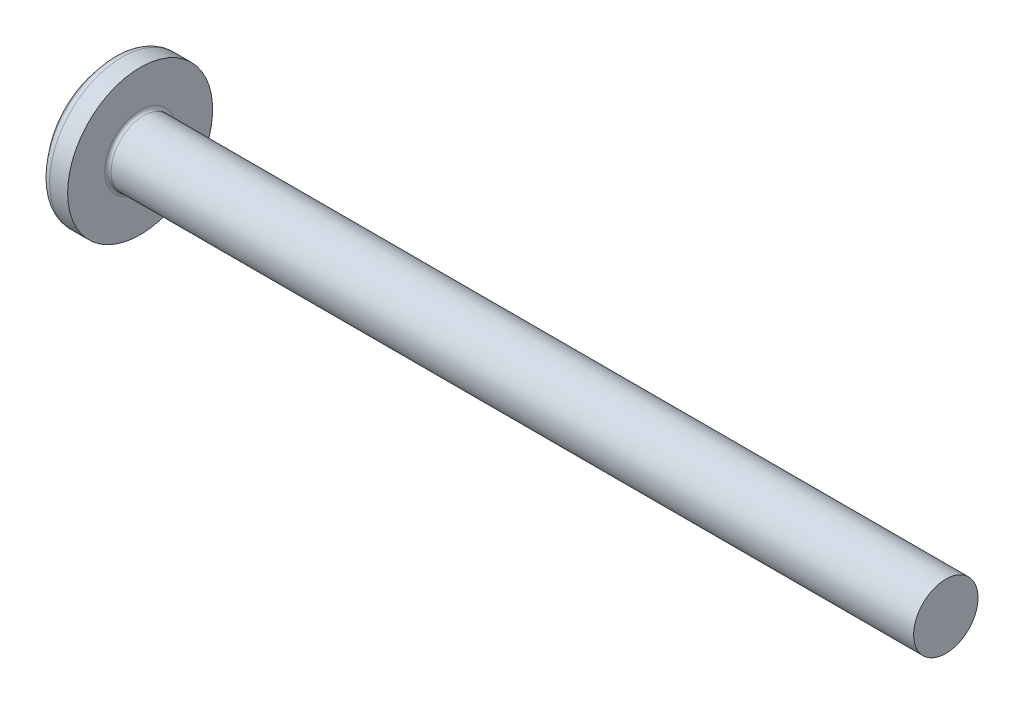
ISO-10303-21;
HEADER;
FILE_DESCRIPTION(('STEP AP214'),'2;1');
FILE_NAME('part.step','',(''),(''),'','','');
FILE_SCHEMA(('AUTOMOTIVE_DESIGN { 1 0 10303 214 1 1 1 1 }'));
ENDSEC;
DATA;
#1=APPLICATION_CONTEXT('core data for automotive mechanical design processes');
#2=APPLICATION_PROTOCOL_DEFINITION('international standard','automotive_design',2000,#1);
#3=PRODUCT_CONTEXT('',#1,'mechanical');
#4=PRODUCT('Part','Part','',(#3));
#5=PRODUCT_RELATED_PRODUCT_CATEGORY('part','',(#4));
#6=PRODUCT_DEFINITION_FORMATION('','',#4);
#7=PRODUCT_DEFINITION_CONTEXT('part definition',#1,'design');
#8=PRODUCT_DEFINITION('design','',#6,#7);
#9=PRODUCT_DEFINITION_SHAPE('','',#8);
#10=(LENGTH_UNIT() NAMED_UNIT(*) SI_UNIT(.MILLI.,.METRE.));
#11=(NAMED_UNIT(*) PLANE_ANGLE_UNIT() SI_UNIT($,.RADIAN.));
#12=(NAMED_UNIT(*) SI_UNIT($,.STERADIAN.) SOLID_ANGLE_UNIT());
#13=UNCERTAINTY_MEASURE_WITH_UNIT(LENGTH_MEASURE(1.E-05),#10,'distance_accuracy_value','');
#14=(GEOMETRIC_REPRESENTATION_CONTEXT(3) GLOBAL_UNCERTAINTY_ASSIGNED_CONTEXT((#13)) GLOBAL_UNIT_ASSIGNED_CONTEXT((#10,
#11,#12)) REPRESENTATION_CONTEXT('',''));
#15=CARTESIAN_POINT('',(0.,0.,0.));
#16=DIRECTION('',(0.,0.,1.));
#17=DIRECTION('',(1.,0.,0.));
#18=AXIS2_PLACEMENT_3D('',#15,#16,#17);
#19=CARTESIAN_POINT('',(3.2,0.,0.));
#20=DIRECTION('',(-1.,0.,0.));
#21=DIRECTION('',(0.,1.,0.));
#22=AXIS2_PLACEMENT_3D('',#19,#20,#21);
#23=SPHERICAL_SURFACE('',#22,3.2);
#24=CARTESIAN_POINT('',(0.841233741586119,0.,0.));
#25=DIRECTION('',(-1.,0.,0.));
#26=DIRECTION('',(0.,0.,1.));
#27=AXIS2_PLACEMENT_3D('',#24,#25,#26);
#28=CIRCLE('',#27,2.16245733788396);
#29=CARTESIAN_POINT('',(0.841233741586119,0.,2.16245733788396));
#30=VERTEX_POINT('',#29);
#31=EDGE_CURVE('E237',#30,#30,#28,.T.);
#32=ORIENTED_EDGE('',*,*,#31,.T.);
#33=EDGE_LOOP('',(#32));
#34=FACE_BOUND('',#33,.T.);
#35=CARTESIAN_POINT('',(0.0716483709574333,0.,0.));
#36=DIRECTION('',(1.,0.,0.));
#37=DIRECTION('',(0.,0.,-1.));
#38=AXIS2_PLACEMENT_3D('',#35,#36,#37);
#39=CIRCLE('',#38,0.673361778739132);
#40=CARTESIAN_POINT('',(0.0716483709574344,-0.369999999999998,-0.562597622699144));
#41=VERTEX_POINT('',#40);
#42=CARTESIAN_POINT('',(0.0716483709574333,-0.56259762269914,-0.37));
#43=VERTEX_POINT('',#42);
#44=EDGE_CURVE('E373',#41,#43,#39,.F.);
#45=ORIENTED_EDGE('',*,*,#44,.F.);
#46=CARTESIAN_POINT('',(3.2,-0.37,0.));
#47=DIRECTION('',(0.,1.,0.));
#48=DIRECTION('',(0.,0.,1.));
#49=AXIS2_PLACEMENT_3D('',#46,#47,#48);
#50=CIRCLE('',#49,3.17853739949682);
#51=CARTESIAN_POINT('',(0.155263655884902,-0.369999999999996,-0.912513339532436));
#52=VERTEX_POINT('',#51);
#53=EDGE_CURVE('E299',#52,#41,#50,.T.);
#54=ORIENTED_EDGE('',*,*,#53,.F.);
#55=CARTESIAN_POINT('',(3.24047110948155,0.,-0.16762475871276));
#56=DIRECTION('',(0.234695116100391,0.,-0.972069031745495));
#57=DIRECTION('',(-0.972069031745495,0.,-0.234695116100391));
#58=AXIS2_PLACEMENT_3D('',#55,#56,#57);
#59=CIRCLE('',#58,3.19535037665102);
#60=CARTESIAN_POINT('',(0.155263655884902,0.370000000000003,-0.912513339532433));
#61=VERTEX_POINT('',#60);
#62=EDGE_CURVE('E271',#52,#61,#59,.T.);
#63=ORIENTED_EDGE('',*,*,#62,.T.);
#64=CARTESIAN_POINT('',(3.2,0.37,0.));
#65=DIRECTION('',(0.,-1.,0.));
#66=DIRECTION('',(0.,0.,-1.));
#67=AXIS2_PLACEMENT_3D('',#64,#65,#66);
#68=CIRCLE('',#67,3.17853739949682);
#69=CARTESIAN_POINT('',(0.0716483709574348,0.370000000000002,-0.562597622699142));
#70=VERTEX_POINT('',#69);
#71=EDGE_CURVE('E326',#70,#61,#68,.T.);
#72=ORIENTED_EDGE('',*,*,#71,.F.);
#73=CARTESIAN_POINT('',(0.0716483709574333,0.562597622699138,-0.37));
#74=VERTEX_POINT('',#73);
#75=EDGE_CURVE('E392',#74,#70,#39,.F.);
#76=ORIENTED_EDGE('',*,*,#75,.F.);
#77=CARTESIAN_POINT('',(3.2,0.,-0.37));
#78=DIRECTION('',(0.,0.,1.));
#79=DIRECTION('',(0.,-1.,0.));
#80=AXIS2_PLACEMENT_3D('',#77,#78,#79);
#81=CIRCLE('',#80,3.17853739949682);
#82=CARTESIAN_POINT('',(0.155263655884903,0.912513339532434,-0.37));
#83=VERTEX_POINT('',#82);
#84=EDGE_CURVE('E265',#83,#74,#81,.T.);
#85=ORIENTED_EDGE('',*,*,#84,.F.);
#86=CARTESIAN_POINT('',(3.24047110948155,0.167624758712761,0.));
#87=DIRECTION('',(0.234695116100391,0.972069031745495,0.));
#88=DIRECTION('',(-0.972069031745495,0.234695116100391,0.));
#89=AXIS2_PLACEMENT_3D('',#86,#87,#88);
#90=CIRCLE('',#89,3.19535037665102);
#91=CARTESIAN_POINT('',(0.155263655884903,0.912513339532434,0.37));
#92=VERTEX_POINT('',#91);
#93=EDGE_CURVE('E268',#83,#92,#90,.T.);
#94=ORIENTED_EDGE('',*,*,#93,.T.);
#95=CARTESIAN_POINT('',(3.2,0.,0.37));
#96=DIRECTION('',(0.,0.,-1.));
#97=DIRECTION('',(0.,1.,0.));
#98=AXIS2_PLACEMENT_3D('',#95,#96,#97);
#99=CIRCLE('',#98,3.17853739949682);
#100=CARTESIAN_POINT('',(0.0716483709574331,0.562597622699138,0.37));
#101=VERTEX_POINT('',#100);
#102=EDGE_CURVE('E261',#101,#92,#99,.T.);
#103=ORIENTED_EDGE('',*,*,#102,.F.);
#104=CARTESIAN_POINT('',(0.0716483709574347,0.369999999999998,0.562597622699144));
#105=VERTEX_POINT('',#104);
#106=EDGE_CURVE('E391',#105,#101,#39,.F.);
#107=ORIENTED_EDGE('',*,*,#106,.F.);
#108=CARTESIAN_POINT('',(0.155263655884903,0.369999999999997,0.912513339532436));
#109=VERTEX_POINT('',#108);
#110=EDGE_CURVE('E281',#109,#105,#68,.T.);
#111=ORIENTED_EDGE('',*,*,#110,.F.);
#112=CARTESIAN_POINT('',(3.24047110948155,0.,0.167624758712761));
#113=DIRECTION('',(0.234695116100391,0.,0.972069031745495));
#114=DIRECTION('',(0.972069031745495,0.,-0.234695116100391));
#115=AXIS2_PLACEMENT_3D('',#112,#113,#114);
#116=CIRCLE('',#115,3.19535037665102);
#117=CARTESIAN_POINT('',(0.155263655884903,-0.370000000000003,0.912513339532433));
#118=VERTEX_POINT('',#117);
#119=EDGE_CURVE('E48',#109,#118,#116,.T.);
#120=ORIENTED_EDGE('',*,*,#119,.T.);
#121=CARTESIAN_POINT('',(0.0716483709574333,-0.370000000000002,0.562597622699142));
#122=VERTEX_POINT('',#121);
#123=EDGE_CURVE('E278',#122,#118,#50,.T.);
#124=ORIENTED_EDGE('',*,*,#123,.F.);
#125=CARTESIAN_POINT('',(0.0716483709574331,-0.562597622699141,0.37));
#126=VERTEX_POINT('',#125);
#127=EDGE_CURVE('E431',#126,#122,#39,.F.);
#128=ORIENTED_EDGE('',*,*,#127,.F.);
#129=CARTESIAN_POINT('',(0.155263655884902,-0.912513339532435,0.37));
#130=VERTEX_POINT('',#129);
#131=EDGE_CURVE('E262',#130,#126,#99,.T.);
#132=ORIENTED_EDGE('',*,*,#131,.F.);
#133=CARTESIAN_POINT('',(3.24047110948155,-0.16762475871276,0.));
#134=DIRECTION('',(0.234695116100391,-0.972069031745495,0.));
#135=DIRECTION('',(0.972069031745495,0.234695116100391,0.));
#136=AXIS2_PLACEMENT_3D('',#133,#134,#135);
#137=CIRCLE('',#136,3.19535037665102);
#138=CARTESIAN_POINT('',(0.155263655884902,-0.912513339532435,-0.37));
#139=VERTEX_POINT('',#138);
#140=EDGE_CURVE('E258',#130,#139,#137,.T.);
#141=ORIENTED_EDGE('',*,*,#140,.T.);
#142=EDGE_CURVE('E63',#43,#139,#81,.T.);
#143=ORIENTED_EDGE('',*,*,#142,.F.);
#144=EDGE_LOOP('',(#45,#54,#63,#72,#76,#85,#94,#103,#107,#111,#120,#124,#128,#132,#141,#143));
#145=FACE_BOUND('',#144,.T.);
#146=ADVANCED_FACE('F34',(#34,#145),#23,.T.);
#147=CARTESIAN_POINT('',(1.75,0.527482216012805,-0.37));
#148=DIRECTION('',(0.,0.,1.));
#149=DIRECTION('',(0.,-1.,0.));
#150=AXIS2_PLACEMENT_3D('',#147,#148,#149);
#151=PLANE('',#150);
#152=ORIENTED_EDGE('',*,*,#84,.T.);
#153=CARTESIAN_POINT('',(-0.971955343485117,0.648166569542613,-0.37));
#154=CARTESIAN_POINT('',(-0.766872339906306,0.631647215248839,-0.37));
#155=CARTESIAN_POINT('',(-0.561800537744921,0.614985954006993,-0.37));
#156=CARTESIAN_POINT('',(-0.151684936613222,0.581268086432697,-0.37));
#157=CARTESIAN_POINT('',(0.0533588616427454,0.564211471421141,-0.37));
#158=CARTESIAN_POINT('',(0.46340379477237,0.529592085215681,-0.37));
#159=CARTESIAN_POINT('',(0.668404929655617,0.512029314135658,-0.37));
#160=CARTESIAN_POINT('',(1.07834476711651,0.476219235115829,-0.37));
#161=CARTESIAN_POINT('',(1.28328347054799,0.457971937004436,-0.37));
#162=CARTESIAN_POINT('',(1.62132593757562,0.427064177525296,-0.37));
#163=CARTESIAN_POINT('',(1.75445532896078,0.414684782153032,-0.37));
#164=CARTESIAN_POINT('',(2.0206619047459,0.38938526299754,-0.37));
#165=CARTESIAN_POINT('',(2.15373908948519,0.376465142789697,-0.37));
#166=CARTESIAN_POINT('',(2.41982964805089,0.349910280247217,-0.37));
#167=CARTESIAN_POINT('',(2.55284301841975,0.336275502822232,-0.37));
#168=CARTESIAN_POINT('',(2.81875830544936,0.307934122969144,-0.37));
#169=CARTESIAN_POINT('',(2.95166021932249,0.293227494496791,-0.37));
#170=CARTESIAN_POINT('',(3.08448262161282,0.277806366268736,-0.37));
#171=B_SPLINE_CURVE_WITH_KNOTS('',3,(#153,#154,#155,#156,#157,#158,#159,#160,#161,#162,#163,
#164,#165,#166,#167,#168,#169,#170),.UNSPECIFIED.,.F.,.F.,(4,2,2,2,2,2,2,2,4),(0.,
0.617242024568861,1.23449761215873,1.85175306087086,2.46899965044083,2.87010992407901,
3.27121754591138,3.67234488099182,4.07348196607046),.UNSPECIFIED.);
#172=CARTESIAN_POINT('',(1.75,0.415013252800437,-0.370000000000001));
#173=VERTEX_POINT('',#172);
#174=EDGE_CURVE('E415',#74,#173,#171,.T.);
#175=ORIENTED_EDGE('',*,*,#174,.T.);
#176=DIRECTION('',(0.,1.,0.));
#177=VECTOR('',#176,1.);
#178=CARTESIAN_POINT('',(1.75,-0.527482216012805,-0.37));
#179=LINE('',#178,#177);
#180=CARTESIAN_POINT('',(1.75,0.527482216012805,-0.37));
#181=VERTEX_POINT('',#180);
#182=EDGE_CURVE('E355',#173,#181,#179,.T.);
#183=ORIENTED_EDGE('',*,*,#182,.T.);
#184=DIRECTION('',(0.972069031745495,-0.234695116100391,0.));
#185=VECTOR('',#184,1.);
#186=CARTESIAN_POINT('',(0.,0.95,-0.37));
#187=LINE('',#186,#185);
#188=EDGE_CURVE('E238',#83,#181,#187,.T.);
#189=ORIENTED_EDGE('',*,*,#188,.F.);
#190=EDGE_LOOP('',(#152,#175,#183,#189));
#191=FACE_BOUND('',#190,.T.);
#192=ADVANCED_FACE('F193',(#191),#151,.T.);
#193=CARTESIAN_POINT('',(1.75,-0.527482216012805,-0.37));
#194=VERTEX_POINT('',#193);
#195=CARTESIAN_POINT('',(1.75,-0.415013252800437,-0.37));
#196=VERTEX_POINT('',#195);
#197=EDGE_CURVE('E246',#194,#196,#179,.T.);
#198=ORIENTED_EDGE('',*,*,#197,.T.);
#199=CARTESIAN_POINT('',(-0.971955343498186,-0.648166569543665,-0.37));
#200=CARTESIAN_POINT('',(-0.766872339917982,-0.631647215249786,-0.37));
#201=CARTESIAN_POINT('',(-0.561800537755202,-0.614985954007833,-0.37));
#202=CARTESIAN_POINT('',(-0.151684936620716,-0.581268086433319,-0.37));
#203=CARTESIAN_POINT('',(0.0533588616366446,-0.564211471421652,-0.37));
#204=CARTESIAN_POINT('',(0.463403794770736,-0.529592085215823,-0.37));
#205=CARTESIAN_POINT('',(0.668404929657056,-0.512029314135538,-0.37));
#206=CARTESIAN_POINT('',(1.0783447671241,-0.476219235115161,-0.37));
#207=CARTESIAN_POINT('',(1.28328347055865,-0.457971937003484,-0.37));
#208=CARTESIAN_POINT('',(1.62132593758934,-0.427064177524027,-0.37));
#209=CARTESIAN_POINT('',(1.75445532897451,-0.414684782151747,-0.37));
#210=CARTESIAN_POINT('',(2.02066190475962,-0.389385262996217,-0.37));
#211=CARTESIAN_POINT('',(2.15373908949891,-0.376465142788354,-0.37));
#212=CARTESIAN_POINT('',(2.4198296480646,-0.349910280245823,-0.37));
#213=CARTESIAN_POINT('',(2.55284301843346,-0.336275502820809,-0.37));
#214=CARTESIAN_POINT('',(2.81875830546307,-0.307934122967648,-0.37));
#215=CARTESIAN_POINT('',(2.95166021933619,-0.293227494495251,-0.37));
#216=CARTESIAN_POINT('',(3.08448262162651,-0.277806366267142,-0.37));
#217=B_SPLINE_CURVE_WITH_KNOTS('',3,(#199,#200,#201,#202,#203,#204,#205,#206,#207,#208,#209,
#210,#211,#212,#213,#214,#215,#216),.UNSPECIFIED.,.F.,.F.,(4,2,2,2,2,2,2,2,4),(0.,
0.617242024573054,1.23449761216712,1.8517530608885,2.46899965046773,2.8701099241059,
3.27121754593828,3.67234488101871,4.07348196609735),.UNSPECIFIED.);
#218=EDGE_CURVE('E390',#196,#43,#217,.F.);
#219=ORIENTED_EDGE('',*,*,#218,.T.);
#220=ORIENTED_EDGE('',*,*,#142,.T.);
#221=DIRECTION('',(0.972069031745495,0.234695116100391,0.));
#222=VECTOR('',#221,1.);
#223=CARTESIAN_POINT('',(0.,-0.95,-0.37));
#224=LINE('',#223,#222);
#225=EDGE_CURVE('E329',#139,#194,#224,.T.);
#226=ORIENTED_EDGE('',*,*,#225,.T.);
#227=EDGE_LOOP('',(#198,#219,#220,#226));
#228=FACE_BOUND('',#227,.T.);
#229=ADVANCED_FACE('F199',(#228),#151,.T.);
#230=CARTESIAN_POINT('',(0.,-0.95,0.37));
#231=DIRECTION('',(0.,0.,-1.));
#232=DIRECTION('',(0.,1.,0.));
#233=AXIS2_PLACEMENT_3D('',#230,#231,#232);
#234=PLANE('',#233);
#235=DIRECTION('',(0.,-1.,0.));
#236=VECTOR('',#235,1.);
#237=CARTESIAN_POINT('',(1.75,0.527482216012805,0.37));
#238=LINE('',#237,#236);
#239=CARTESIAN_POINT('',(1.75,0.527482216012805,0.37));
#240=VERTEX_POINT('',#239);
#241=CARTESIAN_POINT('',(1.75,0.415013252800437,0.37));
#242=VERTEX_POINT('',#241);
#243=EDGE_CURVE('E338',#240,#242,#238,.T.);
#244=ORIENTED_EDGE('',*,*,#243,.T.);
#245=CARTESIAN_POINT('',(-0.971955343498186,0.648166569543665,0.37));
#246=CARTESIAN_POINT('',(-0.766872339917981,0.631647215249786,0.37));
#247=CARTESIAN_POINT('',(-0.561800537755202,0.614985954007833,0.37));
#248=CARTESIAN_POINT('',(-0.151684936620716,0.581268086433319,0.37));
#249=CARTESIAN_POINT('',(0.0533588616366447,0.564211471421652,0.37));
#250=CARTESIAN_POINT('',(0.463403794770737,0.529592085215823,0.37));
#251=CARTESIAN_POINT('',(0.668404929657057,0.512029314135538,0.37));
#252=CARTESIAN_POINT('',(1.0783447671241,0.476219235115161,0.37));
#253=CARTESIAN_POINT('',(1.28328347055865,0.457971937003484,0.37));
#254=CARTESIAN_POINT('',(1.62132593758934,0.427064177524027,0.37));
#255=CARTESIAN_POINT('',(1.75445532897451,0.414684782151747,0.37));
#256=CARTESIAN_POINT('',(2.02066190475962,0.389385262996217,0.37));
#257=CARTESIAN_POINT('',(2.15373908949891,0.376465142788354,0.37));
#258=CARTESIAN_POINT('',(2.4198296480646,0.349910280245823,0.37));
#259=CARTESIAN_POINT('',(2.55284301843346,0.336275502820809,0.37));
#260=CARTESIAN_POINT('',(2.81875830546307,0.307934122967648,0.37));
#261=CARTESIAN_POINT('',(2.95166021933619,0.293227494495251,0.37));
#262=CARTESIAN_POINT('',(3.08448262162651,0.277806366267142,0.37));
#263=B_SPLINE_CURVE_WITH_KNOTS('',3,(#245,#246,#247,#248,#249,#250,#251,#252,#253,#254,#255,
#256,#257,#258,#259,#260,#261,#262),.UNSPECIFIED.,.F.,.F.,(4,2,2,2,2,2,2,2,4),(0.,
0.617242024573054,1.23449761216712,1.8517530608885,2.46899965046773,2.8701099241059,
3.27121754593828,3.67234488101871,4.07348196609735),.UNSPECIFIED.);
#264=EDGE_CURVE('E668',#242,#101,#263,.F.);
#265=ORIENTED_EDGE('',*,*,#264,.T.);
#266=ORIENTED_EDGE('',*,*,#102,.T.);
#267=DIRECTION('',(0.972069031745495,-0.234695116100391,0.));
#268=VECTOR('',#267,1.);
#269=CARTESIAN_POINT('',(0.,0.95,0.37));
#270=LINE('',#269,#268);
#271=EDGE_CURVE('E243',#92,#240,#270,.T.);
#272=ORIENTED_EDGE('',*,*,#271,.T.);
#273=EDGE_LOOP('',(#244,#265,#266,#272));
#274=FACE_BOUND('',#273,.T.);
#275=ADVANCED_FACE('F411',(#274),#234,.T.);
#276=ORIENTED_EDGE('',*,*,#131,.T.);
#277=CARTESIAN_POINT('',(-0.971955343498186,-0.648166569543665,0.37));
#278=CARTESIAN_POINT('',(-0.766872339917981,-0.631647215249786,0.37));
#279=CARTESIAN_POINT('',(-0.561800537755202,-0.614985954007833,0.37));
#280=CARTESIAN_POINT('',(-0.151684936620716,-0.581268086433319,0.37));
#281=CARTESIAN_POINT('',(0.0533588616366447,-0.564211471421652,0.37));
#282=CARTESIAN_POINT('',(0.463403794770737,-0.529592085215823,0.37));
#283=CARTESIAN_POINT('',(0.668404929657056,-0.512029314135538,0.37));
#284=CARTESIAN_POINT('',(1.0783447671241,-0.476219235115162,0.37));
#285=CARTESIAN_POINT('',(1.28328347055865,-0.457971937003484,0.37));
#286=CARTESIAN_POINT('',(1.62132593758934,-0.427064177524027,0.37));
#287=CARTESIAN_POINT('',(1.75445532897451,-0.414684782151747,0.37));
#288=CARTESIAN_POINT('',(2.02066190475962,-0.389385262996217,0.37));
#289=CARTESIAN_POINT('',(2.15373908949891,-0.376465142788354,0.37));
#290=CARTESIAN_POINT('',(2.4198296480646,-0.349910280245823,0.37));
#291=CARTESIAN_POINT('',(2.55284301843346,-0.336275502820809,0.37));
#292=CARTESIAN_POINT('',(2.81875830546307,-0.307934122967648,0.37));
#293=CARTESIAN_POINT('',(2.95166021933619,-0.293227494495252,0.37));
#294=CARTESIAN_POINT('',(3.08448262162651,-0.277806366267142,0.37));
#295=B_SPLINE_CURVE_WITH_KNOTS('',3,(#277,#278,#279,#280,#281,#282,#283,#284,#285,#286,#287,
#288,#289,#290,#291,#292,#293,#294),.UNSPECIFIED.,.F.,.F.,(4,2,2,2,2,2,2,2,4),(0.,
0.617242024573054,1.23449761216712,1.8517530608885,2.46899965046773,2.8701099241059,
3.27121754593828,3.67234488101871,4.07348196609735),.UNSPECIFIED.);
#296=CARTESIAN_POINT('',(1.75,-0.415013252800438,0.37));
#297=VERTEX_POINT('',#296);
#298=EDGE_CURVE('E432',#126,#297,#295,.T.);
#299=ORIENTED_EDGE('',*,*,#298,.T.);
#300=CARTESIAN_POINT('',(1.75,-0.527482216012805,0.37));
#301=VERTEX_POINT('',#300);
#302=EDGE_CURVE('E340',#297,#301,#238,.T.);
#303=ORIENTED_EDGE('',*,*,#302,.T.);
#304=DIRECTION('',(0.972069031745495,0.234695116100391,0.));
#305=VECTOR('',#304,1.);
#306=CARTESIAN_POINT('',(0.,-0.95,0.37));
#307=LINE('',#306,#305);
#308=EDGE_CURVE('E331',#130,#301,#307,.T.);
#309=ORIENTED_EDGE('',*,*,#308,.F.);
#310=EDGE_LOOP('',(#276,#299,#303,#309));
#311=FACE_BOUND('',#310,.T.);
#312=ADVANCED_FACE('F524',(#311),#234,.T.);
#313=CARTESIAN_POINT('',(1.75,0.527482216012805,0.37));
#314=DIRECTION('',(0.234695116100391,0.972069031745495,0.));
#315=DIRECTION('',(-0.972069031745495,0.234695116100391,0.));
#316=AXIS2_PLACEMENT_3D('',#313,#314,#315);
#317=PLANE('',#316);
#318=CARTESIAN_POINT('',(3.40675133188542,0.127478272375057,0.));
#319=DIRECTION('',(0.234695116100391,0.972069031745495,0.));
#320=DIRECTION('',(-0.972069031745495,0.234695116100391,0.));
#321=AXIS2_PLACEMENT_3D('',#318,#319,#320);
#322=ELLIPSE('',#321,1.87540613750916,0.421283911405532);
#323=CARTESIAN_POINT('',(1.75,0.527482216012806,0.175779725196677));
#324=VERTEX_POINT('',#323);
#325=CARTESIAN_POINT('',(1.75,0.527482216012806,-0.175779725196677));
#326=VERTEX_POINT('',#325);
#327=EDGE_CURVE('E304',#324,#326,#322,.F.);
#328=ORIENTED_EDGE('',*,*,#327,.F.);
#329=DIRECTION('',(0.,0.,-1.));
#330=VECTOR('',#329,1.);
#331=CARTESIAN_POINT('',(1.75,0.527482216012805,0.37));
#332=LINE('',#331,#330);
#333=EDGE_CURVE('E341',#240,#324,#332,.T.);
#334=ORIENTED_EDGE('',*,*,#333,.F.);
#335=ORIENTED_EDGE('',*,*,#271,.F.);
#336=ORIENTED_EDGE('',*,*,#93,.F.);
#337=ORIENTED_EDGE('',*,*,#188,.T.);
#338=EDGE_CURVE('E343',#326,#181,#332,.T.);
#339=ORIENTED_EDGE('',*,*,#338,.F.);
#340=EDGE_LOOP('',(#328,#334,#335,#336,#337,#339));
#341=FACE_BOUND('',#340,.T.);
#342=ADVANCED_FACE('F409',(#341),#317,.F.);
#343=CARTESIAN_POINT('',(1.75,-0.527482216012805,-0.37));
#344=DIRECTION('',(0.234695116100391,-0.972069031745495,0.));
#345=DIRECTION('',(0.972069031745495,0.234695116100391,0.));
#346=AXIS2_PLACEMENT_3D('',#343,#344,#345);
#347=PLANE('',#346);
#348=CARTESIAN_POINT('',(3.40675133188542,-0.127478272375056,0.));
#349=DIRECTION('',(0.234695116100391,-0.972069031745495,0.));
#350=DIRECTION('',(-0.972069031745495,-0.234695116100391,0.));
#351=AXIS2_PLACEMENT_3D('',#348,#349,#350);
#352=ELLIPSE('',#351,1.87540613750917,0.421283911405533);
#353=CARTESIAN_POINT('',(1.75,-0.527482216012806,-0.175779725196679));
#354=VERTEX_POINT('',#353);
#355=CARTESIAN_POINT('',(1.75,-0.527482216012806,0.175779725196679));
#356=VERTEX_POINT('',#355);
#357=EDGE_CURVE('E670',#354,#356,#352,.F.);
#358=ORIENTED_EDGE('',*,*,#357,.F.);
#359=DIRECTION('',(0.,0.,1.));
#360=VECTOR('',#359,1.);
#361=CARTESIAN_POINT('',(1.75,-0.527482216012805,-0.37));
#362=LINE('',#361,#360);
#363=EDGE_CURVE('E334',#194,#354,#362,.T.);
#364=ORIENTED_EDGE('',*,*,#363,.F.);
#365=ORIENTED_EDGE('',*,*,#225,.F.);
#366=ORIENTED_EDGE('',*,*,#140,.F.);
#367=ORIENTED_EDGE('',*,*,#308,.T.);
#368=EDGE_CURVE('E337',#356,#301,#362,.T.);
#369=ORIENTED_EDGE('',*,*,#368,.F.);
#370=EDGE_LOOP('',(#358,#364,#365,#366,#367,#369));
#371=FACE_BOUND('',#370,.T.);
#372=ADVANCED_FACE('F511',(#371),#347,.F.);
#373=CARTESIAN_POINT('',(1.75,0.527482216012805,-0.37));
#374=DIRECTION('',(-1.,0.,0.));
#375=DIRECTION('',(0.,0.,1.));
#376=AXIS2_PLACEMENT_3D('',#373,#374,#375);
#377=PLANE('',#376);
#378=DIRECTION('',(0.,1.,0.));
#379=VECTOR('',#378,1.);
#380=CARTESIAN_POINT('',(1.75,-0.370000000000002,0.527482216012804));
#381=LINE('',#380,#379);
#382=CARTESIAN_POINT('',(1.75,-0.370000000000002,0.527482216012804));
#383=VERTEX_POINT('',#382);
#384=CARTESIAN_POINT('',(1.75,-0.175779725196681,0.527482216012805));
#385=VERTEX_POINT('',#384);
#386=EDGE_CURVE('E319',#383,#385,#381,.T.);
#387=ORIENTED_EDGE('',*,*,#386,.T.);
#388=CARTESIAN_POINT('',(1.75,0.,0.));
#389=DIRECTION('',(-1.,0.,0.));
#390=DIRECTION('',(0.,0.,1.));
#391=AXIS2_PLACEMENT_3D('',#388,#389,#390);
#392=CIRCLE('',#391,0.556);
#393=CARTESIAN_POINT('',(1.75,-0.370000000000001,0.415013252800437));
#394=VERTEX_POINT('',#393);
#395=EDGE_CURVE('E698',#394,#385,#392,.T.);
#396=ORIENTED_EDGE('',*,*,#395,.F.);
#397=DIRECTION('',(0.,0.,-1.));
#398=VECTOR('',#397,1.);
#399=CARTESIAN_POINT('',(1.75,-0.370000000000002,0.527482216012804));
#400=LINE('',#399,#398);
#401=EDGE_CURVE('E315',#383,#394,#400,.T.);
#402=ORIENTED_EDGE('',*,*,#401,.F.);
#403=EDGE_LOOP('',(#387,#396,#402));
#404=FACE_BOUND('',#403,.T.);
#405=ADVANCED_FACE('F468',(#404),#377,.T.);
#406=ORIENTED_EDGE('',*,*,#302,.F.);
#407=EDGE_CURVE('E703',#356,#297,#392,.T.);
#408=ORIENTED_EDGE('',*,*,#407,.F.);
#409=ORIENTED_EDGE('',*,*,#368,.T.);
#410=EDGE_LOOP('',(#406,#408,#409));
#411=FACE_BOUND('',#410,.T.);
#412=ADVANCED_FACE('F498',(#411),#377,.T.);
#413=ORIENTED_EDGE('',*,*,#363,.T.);
#414=EDGE_CURVE('E384',#196,#354,#392,.T.);
#415=ORIENTED_EDGE('',*,*,#414,.F.);
#416=ORIENTED_EDGE('',*,*,#197,.F.);
#417=EDGE_LOOP('',(#413,#415,#416));
#418=FACE_BOUND('',#417,.T.);
#419=ADVANCED_FACE('F492',(#418),#377,.T.);
#420=CARTESIAN_POINT('',(1.75,-0.369999999999998,-0.415013252800438));
#421=VERTEX_POINT('',#420);
#422=CARTESIAN_POINT('',(1.75,-0.369999999999998,-0.527482216012806));
#423=VERTEX_POINT('',#422);
#424=EDGE_CURVE('E318',#421,#423,#400,.T.);
#425=ORIENTED_EDGE('',*,*,#424,.F.);
#426=CARTESIAN_POINT('',(1.75,-0.175779725196679,-0.527482216012806));
#427=VERTEX_POINT('',#426);
#428=EDGE_CURVE('E55',#427,#421,#392,.T.);
#429=ORIENTED_EDGE('',*,*,#428,.F.);
#430=DIRECTION('',(0.,-1.,0.));
#431=VECTOR('',#430,1.);
#432=CARTESIAN_POINT('',(1.75,0.370000000000002,-0.527482216012803));
#433=LINE('',#432,#431);
#434=EDGE_CURVE('E314',#427,#423,#433,.T.);
#435=ORIENTED_EDGE('',*,*,#434,.T.);
#436=EDGE_LOOP('',(#425,#429,#435));
#437=FACE_BOUND('',#436,.T.);
#438=ADVANCED_FACE('F379',(#437),#377,.T.);
#439=CARTESIAN_POINT('',(1.75,0.370000000000002,-0.527482216012803));
#440=VERTEX_POINT('',#439);
#441=CARTESIAN_POINT('',(1.75,0.175779725196683,-0.527482216012804));
#442=VERTEX_POINT('',#441);
#443=EDGE_CURVE('E311',#440,#442,#433,.T.);
#444=ORIENTED_EDGE('',*,*,#443,.T.);
#445=CARTESIAN_POINT('',(1.75,0.370000000000001,-0.415013252800437));
#446=VERTEX_POINT('',#445);
#447=EDGE_CURVE('E383',#446,#442,#392,.T.);
#448=ORIENTED_EDGE('',*,*,#447,.F.);
#449=DIRECTION('',(0.,0.,1.));
#450=VECTOR('',#449,1.);
#451=CARTESIAN_POINT('',(1.75,0.370000000000002,-0.527482216012803));
#452=LINE('',#451,#450);
#453=EDGE_CURVE('E323',#440,#446,#452,.T.);
#454=ORIENTED_EDGE('',*,*,#453,.F.);
#455=EDGE_LOOP('',(#444,#448,#454));
#456=FACE_BOUND('',#455,.T.);
#457=ADVANCED_FACE('F480',(#456),#377,.T.);
#458=ORIENTED_EDGE('',*,*,#182,.F.);
#459=EDGE_CURVE('E687',#326,#173,#392,.T.);
#460=ORIENTED_EDGE('',*,*,#459,.F.);
#461=ORIENTED_EDGE('',*,*,#338,.T.);
#462=EDGE_LOOP('',(#458,#460,#461));
#463=FACE_BOUND('',#462,.T.);
#464=ADVANCED_FACE('F474',(#463),#377,.T.);
#465=ORIENTED_EDGE('',*,*,#333,.T.);
#466=EDGE_CURVE('E689',#242,#324,#392,.T.);
#467=ORIENTED_EDGE('',*,*,#466,.F.);
#468=ORIENTED_EDGE('',*,*,#243,.F.);
#469=EDGE_LOOP('',(#465,#467,#468));
#470=FACE_BOUND('',#469,.T.);
#471=ADVANCED_FACE('F466',(#470),#377,.T.);
#472=CARTESIAN_POINT('',(1.75,0.369999999999999,0.415013252800439));
#473=VERTEX_POINT('',#472);
#474=CARTESIAN_POINT('',(1.75,0.369999999999998,0.527482216012807));
#475=VERTEX_POINT('',#474);
#476=EDGE_CURVE('E296',#473,#475,#452,.T.);
#477=ORIENTED_EDGE('',*,*,#476,.F.);
#478=CARTESIAN_POINT('',(1.75,0.175779725196678,0.527482216012806));
#479=VERTEX_POINT('',#478);
#480=EDGE_CURVE('E385',#479,#473,#392,.T.);
#481=ORIENTED_EDGE('',*,*,#480,.F.);
#482=EDGE_CURVE('E322',#479,#475,#381,.T.);
#483=ORIENTED_EDGE('',*,*,#482,.T.);
#484=EDGE_LOOP('',(#477,#481,#483));
#485=FACE_BOUND('',#484,.T.);
#486=ADVANCED_FACE('F460',(#485),#377,.T.);
#487=CARTESIAN_POINT('',(1.75,0.369999999999998,0.527482216012807));
#488=DIRECTION('',(0.,-1.,0.));
#489=DIRECTION('',(0.,0.,-1.));
#490=AXIS2_PLACEMENT_3D('',#487,#488,#489);
#491=PLANE('',#490);
#492=ORIENTED_EDGE('',*,*,#110,.T.);
#493=CARTESIAN_POINT('',(-0.971955343498185,0.369999999999998,0.648166569543666));
#494=CARTESIAN_POINT('',(-0.766872339917981,0.369999999999998,0.631647215249787));
#495=CARTESIAN_POINT('',(-0.561800537755202,0.369999999999998,0.614985954007834));
#496=CARTESIAN_POINT('',(-0.151684936620716,0.369999999999998,0.58126808643332));
#497=CARTESIAN_POINT('',(0.0533588616366449,0.369999999999998,0.564211471421653));
#498=CARTESIAN_POINT('',(0.463403794770737,0.369999999999998,0.529592085215824));
#499=CARTESIAN_POINT('',(0.668404929657056,0.369999999999998,0.512029314135539));
#500=CARTESIAN_POINT('',(1.0783447671241,0.369999999999998,0.476219235115163));
#501=CARTESIAN_POINT('',(1.28328347055865,0.369999999999998,0.457971937003486));
#502=CARTESIAN_POINT('',(1.62132593758934,0.369999999999999,0.427064177524028));
#503=CARTESIAN_POINT('',(1.75445532897451,0.369999999999999,0.414684782151748));
#504=CARTESIAN_POINT('',(2.02066190475962,0.369999999999999,0.389385262996218));
#505=CARTESIAN_POINT('',(2.15373908949891,0.369999999999999,0.376465142788355));
#506=CARTESIAN_POINT('',(2.4198296480646,0.369999999999999,0.349910280245824));
#507=CARTESIAN_POINT('',(2.55284301843346,0.369999999999999,0.33627550282081));
#508=CARTESIAN_POINT('',(2.81875830546307,0.369999999999999,0.307934122967649));
#509=CARTESIAN_POINT('',(2.95166021933619,0.369999999999999,0.293227494495252));
#510=CARTESIAN_POINT('',(3.08448262162651,0.369999999999999,0.277806366267143));
#511=B_SPLINE_CURVE_WITH_KNOTS('',3,(#493,#494,#495,#496,#497,#498,#499,#500,#501,#502,#503,
#504,#505,#506,#507,#508,#509,#510),.UNSPECIFIED.,.F.,.F.,(4,2,2,2,2,2,2,2,4),(0.,
0.617242024573054,1.23449761216712,1.8517530608885,2.46899965046773,2.8701099241059,
3.27121754593828,3.67234488101871,4.07348196609735),.UNSPECIFIED.);
#512=EDGE_CURVE('E667',#105,#473,#511,.T.);
#513=ORIENTED_EDGE('',*,*,#512,.T.);
#514=ORIENTED_EDGE('',*,*,#476,.T.);
#515=DIRECTION('',(0.972069031745495,0.,-0.234695116100391));
#516=VECTOR('',#515,1.);
#517=CARTESIAN_POINT('',(0.,0.369999999999997,0.950000000000001));
#518=LINE('',#517,#516);
#519=EDGE_CURVE('E289',#109,#475,#518,.T.);
#520=ORIENTED_EDGE('',*,*,#519,.F.);
#521=EDGE_LOOP('',(#492,#513,#514,#520));
#522=FACE_BOUND('',#521,.T.);
#523=ADVANCED_FACE('F293',(#522),#491,.T.);
#524=CARTESIAN_POINT('',(0.,-0.369999999999996,-0.950000000000001));
#525=DIRECTION('',(0.,1.,0.));
#526=DIRECTION('',(0.,0.,1.));
#527=AXIS2_PLACEMENT_3D('',#524,#525,#526);
#528=PLANE('',#527);
#529=ORIENTED_EDGE('',*,*,#401,.T.);
#530=CARTESIAN_POINT('',(-0.971955343485117,-0.370000000000002,0.648166569542611));
#531=CARTESIAN_POINT('',(-0.766872339906306,-0.370000000000002,0.631647215248838));
#532=CARTESIAN_POINT('',(-0.561800537744921,-0.370000000000002,0.614985954006992));
#533=CARTESIAN_POINT('',(-0.151684936613222,-0.370000000000002,0.581268086432695));
#534=CARTESIAN_POINT('',(0.0533588616427447,-0.370000000000002,0.56421147142114));
#535=CARTESIAN_POINT('',(0.46340379477237,-0.370000000000002,0.529592085215679));
#536=CARTESIAN_POINT('',(0.668404929655616,-0.370000000000002,0.512029314135657));
#537=CARTESIAN_POINT('',(1.07834476711651,-0.370000000000001,0.476219235115828));
#538=CARTESIAN_POINT('',(1.28328347054799,-0.370000000000001,0.457971937004435));
#539=CARTESIAN_POINT('',(1.62132593757562,-0.370000000000001,0.427064177525295));
#540=CARTESIAN_POINT('',(1.75445532896078,-0.370000000000001,0.414684782153031));
#541=CARTESIAN_POINT('',(2.0206619047459,-0.370000000000001,0.389385262997539));
#542=CARTESIAN_POINT('',(2.15373908948519,-0.370000000000001,0.376465142789696));
#543=CARTESIAN_POINT('',(2.41982964805089,-0.370000000000001,0.349910280247216));
#544=CARTESIAN_POINT('',(2.55284301841975,-0.370000000000001,0.336275502822231));
#545=CARTESIAN_POINT('',(2.81875830544936,-0.370000000000001,0.307934122969143));
#546=CARTESIAN_POINT('',(2.95166021932249,-0.370000000000001,0.29322749449679));
#547=CARTESIAN_POINT('',(3.08448262161282,-0.370000000000001,0.277806366268735));
#548=B_SPLINE_CURVE_WITH_KNOTS('',3,(#530,#531,#532,#533,#534,#535,#536,#537,#538,#539,#540,
#541,#542,#543,#544,#545,#546,#547),.UNSPECIFIED.,.F.,.F.,(4,2,2,2,2,2,2,2,4),(0.,
0.617242024568861,1.23449761215873,1.85175306087086,2.46899965044083,2.87010992407901,
3.27121754591138,3.67234488099182,4.07348196607046),.UNSPECIFIED.);
#549=EDGE_CURVE('E424',#394,#122,#548,.F.);
#550=ORIENTED_EDGE('',*,*,#549,.T.);
#551=ORIENTED_EDGE('',*,*,#123,.T.);
#552=DIRECTION('',(0.972069031745495,0.,-0.234695116100391));
#553=VECTOR('',#552,1.);
#554=CARTESIAN_POINT('',(0.,-0.370000000000003,0.949999999999999));
#555=LINE('',#554,#553);
#556=EDGE_CURVE('E291',#118,#383,#555,.T.);
#557=ORIENTED_EDGE('',*,*,#556,.T.);
#558=EDGE_LOOP('',(#529,#550,#551,#557));
#559=FACE_BOUND('',#558,.T.);
#560=ADVANCED_FACE('F228',(#559),#528,.T.);
#561=CARTESIAN_POINT('',(1.75,-0.370000000000002,0.527482216012804));
#562=DIRECTION('',(0.234695116100391,0.,0.972069031745495));
#563=DIRECTION('',(-0.972069031745495,0.,0.234695116100391));
#564=AXIS2_PLACEMENT_3D('',#561,#562,#563);
#565=PLANE('',#564);
#566=CARTESIAN_POINT('',(3.40675133188542,0.,0.127478272375057));
#567=DIRECTION('',(0.234695116100391,0.,0.972069031745495));
#568=DIRECTION('',(-0.972069031745495,0.,0.234695116100391));
#569=AXIS2_PLACEMENT_3D('',#566,#567,#568);
#570=ELLIPSE('',#569,1.87540613750916,0.421283911405532);
#571=EDGE_CURVE('E422',#385,#479,#570,.F.);
#572=ORIENTED_EDGE('',*,*,#571,.F.);
#573=ORIENTED_EDGE('',*,*,#386,.F.);
#574=ORIENTED_EDGE('',*,*,#556,.F.);
#575=ORIENTED_EDGE('',*,*,#119,.F.);
#576=ORIENTED_EDGE('',*,*,#519,.T.);
#577=ORIENTED_EDGE('',*,*,#482,.F.);
#578=EDGE_LOOP('',(#572,#573,#574,#575,#576,#577));
#579=FACE_BOUND('',#578,.T.);
#580=ADVANCED_FACE('F287',(#579),#565,.F.);
#581=CARTESIAN_POINT('',(1.75,0.370000000000002,-0.527482216012803));
#582=DIRECTION('',(0.234695116100391,0.,-0.972069031745495));
#583=DIRECTION('',(0.972069031745495,0.,0.234695116100391));
#584=AXIS2_PLACEMENT_3D('',#581,#582,#583);
#585=PLANE('',#584);
#586=CARTESIAN_POINT('',(3.40675133188542,0.,-0.127478272375056));
#587=DIRECTION('',(0.234695116100391,0.,-0.972069031745495));
#588=DIRECTION('',(-0.972069031745495,0.,-0.234695116100391));
#589=AXIS2_PLACEMENT_3D('',#586,#587,#588);
#590=ELLIPSE('',#589,1.87540613750917,0.421283911405533);
#591=EDGE_CURVE('E377',#442,#427,#590,.F.);
#592=ORIENTED_EDGE('',*,*,#591,.F.);
#593=ORIENTED_EDGE('',*,*,#443,.F.);
#594=DIRECTION('',(0.972069031745495,0.,0.234695116100391));
#595=VECTOR('',#594,1.);
#596=CARTESIAN_POINT('',(0.,0.370000000000003,-0.949999999999999));
#597=LINE('',#596,#595);
#598=EDGE_CURVE('E301',#61,#440,#597,.T.);
#599=ORIENTED_EDGE('',*,*,#598,.F.);
#600=ORIENTED_EDGE('',*,*,#62,.F.);
#601=DIRECTION('',(0.972069031745495,0.,0.234695116100391));
#602=VECTOR('',#601,1.);
#603=CARTESIAN_POINT('',(0.,-0.369999999999996,-0.950000000000001));
#604=LINE('',#603,#602);
#605=EDGE_CURVE('E308',#52,#423,#604,.T.);
#606=ORIENTED_EDGE('',*,*,#605,.T.);
#607=ORIENTED_EDGE('',*,*,#434,.F.);
#608=EDGE_LOOP('',(#592,#593,#599,#600,#606,#607));
#609=FACE_BOUND('',#608,.T.);
#610=ADVANCED_FACE('F368',(#609),#585,.F.);
#611=ORIENTED_EDGE('',*,*,#453,.T.);
#612=CARTESIAN_POINT('',(-0.971955343485117,0.370000000000002,-0.648166569542611));
#613=CARTESIAN_POINT('',(-0.766872339906306,0.370000000000002,-0.631647215248838));
#614=CARTESIAN_POINT('',(-0.561800537744921,0.370000000000002,-0.614985954006992));
#615=CARTESIAN_POINT('',(-0.151684936613222,0.370000000000002,-0.581268086432695));
#616=CARTESIAN_POINT('',(0.0533588616427453,0.370000000000002,-0.56421147142114));
#617=CARTESIAN_POINT('',(0.46340379477237,0.370000000000002,-0.529592085215679));
#618=CARTESIAN_POINT('',(0.668404929655617,0.370000000000002,-0.512029314135657));
#619=CARTESIAN_POINT('',(1.07834476711651,0.370000000000001,-0.476219235115828));
#620=CARTESIAN_POINT('',(1.28328347054799,0.370000000000001,-0.457971937004435));
#621=CARTESIAN_POINT('',(1.62132593757562,0.370000000000001,-0.427064177525295));
#622=CARTESIAN_POINT('',(1.75445532896078,0.370000000000001,-0.414684782153031));
#623=CARTESIAN_POINT('',(2.0206619047459,0.370000000000001,-0.389385262997539));
#624=CARTESIAN_POINT('',(2.15373908948519,0.370000000000001,-0.376465142789696));
#625=CARTESIAN_POINT('',(2.41982964805089,0.370000000000001,-0.349910280247216));
#626=CARTESIAN_POINT('',(2.55284301841975,0.370000000000001,-0.336275502822231));
#627=CARTESIAN_POINT('',(2.81875830544936,0.370000000000001,-0.307934122969142));
#628=CARTESIAN_POINT('',(2.95166021932249,0.370000000000001,-0.29322749449679));
#629=CARTESIAN_POINT('',(3.08448262161282,0.370000000000001,-0.277806366268735));
#630=B_SPLINE_CURVE_WITH_KNOTS('',3,(#612,#613,#614,#615,#616,#617,#618,#619,#620,#621,#622,
#623,#624,#625,#626,#627,#628,#629),.UNSPECIFIED.,.F.,.F.,(4,2,2,2,2,2,2,2,4),(0.,
0.617242024568861,1.23449761215873,1.85175306087086,2.46899965044083,2.87010992407901,
3.27121754591138,3.67234488099182,4.07348196607046),.UNSPECIFIED.);
#631=EDGE_CURVE('E364',#446,#70,#630,.F.);
#632=ORIENTED_EDGE('',*,*,#631,.T.);
#633=ORIENTED_EDGE('',*,*,#71,.T.);
#634=ORIENTED_EDGE('',*,*,#598,.T.);
#635=EDGE_LOOP('',(#611,#632,#633,#634));
#636=FACE_BOUND('',#635,.T.);
#637=ADVANCED_FACE('F226',(#636),#491,.T.);
#638=ORIENTED_EDGE('',*,*,#53,.T.);
#639=CARTESIAN_POINT('',(-0.971955343498186,-0.369999999999997,-0.648166569543666));
#640=CARTESIAN_POINT('',(-0.766872339917981,-0.369999999999998,-0.631647215249787));
#641=CARTESIAN_POINT('',(-0.561800537755202,-0.369999999999998,-0.614985954007835));
#642=CARTESIAN_POINT('',(-0.151684936620716,-0.369999999999998,-0.58126808643332));
#643=CARTESIAN_POINT('',(0.0533588616366446,-0.369999999999998,-0.564211471421654));
#644=CARTESIAN_POINT('',(0.463403794770736,-0.369999999999998,-0.529592085215824));
#645=CARTESIAN_POINT('',(0.668404929657056,-0.369999999999998,-0.512029314135539));
#646=CARTESIAN_POINT('',(1.0783447671241,-0.369999999999998,-0.476219235115163));
#647=CARTESIAN_POINT('',(1.28328347055864,-0.369999999999998,-0.457971937003486));
#648=CARTESIAN_POINT('',(1.62132593758934,-0.369999999999998,-0.427064177524029));
#649=CARTESIAN_POINT('',(1.75445532897451,-0.369999999999998,-0.414684782151748));
#650=CARTESIAN_POINT('',(2.02066190475962,-0.369999999999998,-0.389385262996219));
#651=CARTESIAN_POINT('',(2.15373908949891,-0.369999999999998,-0.376465142788355));
#652=CARTESIAN_POINT('',(2.4198296480646,-0.369999999999998,-0.349910280245824));
#653=CARTESIAN_POINT('',(2.55284301843346,-0.369999999999998,-0.33627550282081));
#654=CARTESIAN_POINT('',(2.81875830546307,-0.369999999999999,-0.307934122967649));
#655=CARTESIAN_POINT('',(2.95166021933619,-0.369999999999999,-0.293227494495253));
#656=CARTESIAN_POINT('',(3.08448262162651,-0.369999999999999,-0.277806366267144));
#657=B_SPLINE_CURVE_WITH_KNOTS('',3,(#639,#640,#641,#642,#643,#644,#645,#646,#647,#648,#649,
#650,#651,#652,#653,#654,#655,#656),.UNSPECIFIED.,.F.,.F.,(4,2,2,2,2,2,2,2,4),(0.,
0.617242024573054,1.23449761216712,1.8517530608885,2.46899965046773,2.8701099241059,
3.27121754593828,3.67234488101871,4.07348196609735),.UNSPECIFIED.);
#658=EDGE_CURVE('E11',#41,#421,#657,.T.);
#659=ORIENTED_EDGE('',*,*,#658,.T.);
#660=ORIENTED_EDGE('',*,*,#424,.T.);
#661=ORIENTED_EDGE('',*,*,#605,.F.);
#662=EDGE_LOOP('',(#638,#659,#660,#661));
#663=FACE_BOUND('',#662,.T.);
#664=ADVANCED_FACE('F221',(#663),#528,.T.);
#665=CARTESIAN_POINT('',(-25.4,0.,0.));
#666=DIRECTION('',(-1.,0.,0.));
#667=DIRECTION('',(0.,0.,1.));
#668=AXIS2_PLACEMENT_3D('',#665,#666,#667);
#669=CYLINDRICAL_SURFACE('',#668,1.);
#670=CARTESIAN_POINT('',(1.7,0.,0.));
#671=DIRECTION('',(-1.,0.,0.));
#672=DIRECTION('',(0.,0.,1.));
#673=AXIS2_PLACEMENT_3D('',#670,#671,#672);
#674=CIRCLE('',#673,1.);
#675=CARTESIAN_POINT('',(1.7,0.,1.));
#676=VERTEX_POINT('',#675);
#677=EDGE_CURVE('E232',#676,#676,#674,.F.);
#678=ORIENTED_EDGE('',*,*,#677,.T.);
#679=EDGE_LOOP('',(#678));
#680=FACE_BOUND('',#679,.T.);
#681=CARTESIAN_POINT('',(26.6,0.,0.));
#682=DIRECTION('',(-1.,0.,0.));
#683=DIRECTION('',(0.,0.,1.));
#684=AXIS2_PLACEMENT_3D('',#681,#682,#683);
#685=CIRCLE('',#684,1.);
#686=CARTESIAN_POINT('',(26.6,0.,1.));
#687=VERTEX_POINT('',#686);
#688=EDGE_CURVE('E235',#687,#687,#685,.T.);
#689=ORIENTED_EDGE('',*,*,#688,.T.);
#690=EDGE_LOOP('',(#689));
#691=FACE_BOUND('',#690,.T.);
#692=ADVANCED_FACE('F218',(#680,#691),#669,.T.);
#693=CARTESIAN_POINT('',(1.6,1.,0.));
#694=DIRECTION('',(-1.,0.,0.));
#695=DIRECTION('',(0.,0.,1.));
#696=AXIS2_PLACEMENT_3D('',#693,#694,#695);
#697=PLANE('',#696);
#698=CARTESIAN_POINT('',(1.6,0.,0.));
#699=DIRECTION('',(-1.,0.,0.));
#700=DIRECTION('',(0.,0.,1.));
#701=AXIS2_PLACEMENT_3D('',#698,#699,#700);
#702=CIRCLE('',#701,1.1);
#703=CARTESIAN_POINT('',(1.6,0.,1.1));
#704=VERTEX_POINT('',#703);
#705=EDGE_CURVE('E254',#704,#704,#702,.T.);
#706=ORIENTED_EDGE('',*,*,#705,.T.);
#707=EDGE_LOOP('',(#706));
#708=FACE_BOUND('',#707,.T.);
#709=CARTESIAN_POINT('',(1.6,0.,0.));
#710=DIRECTION('',(-1.,0.,0.));
#711=DIRECTION('',(0.,0.,1.));
#712=AXIS2_PLACEMENT_3D('',#709,#710,#711);
#713=CIRCLE('',#712,2.25);
#714=CARTESIAN_POINT('',(1.6,0.,2.25));
#715=VERTEX_POINT('',#714);
#716=EDGE_CURVE('E251',#715,#715,#713,.T.);
#717=ORIENTED_EDGE('',*,*,#716,.F.);
#718=EDGE_LOOP('',(#717));
#719=FACE_BOUND('',#718,.T.);
#720=ADVANCED_FACE('F215',(#708,#719),#697,.F.);
#721=CARTESIAN_POINT('',(-25.4,0.,0.));
#722=DIRECTION('',(-1.,0.,0.));
#723=DIRECTION('',(0.,0.,1.));
#724=AXIS2_PLACEMENT_3D('',#721,#722,#723);
#725=CYLINDRICAL_SURFACE('',#724,2.25);
#726=ORIENTED_EDGE('',*,*,#716,.T.);
#727=EDGE_LOOP('',(#726));
#728=FACE_BOUND('',#727,.T.);
#729=CARTESIAN_POINT('',(1.04025464463979,0.,0.));
#730=DIRECTION('',(-1.,0.,0.));
#731=DIRECTION('',(0.,0.,1.));
#732=AXIS2_PLACEMENT_3D('',#729,#730,#731);
#733=CIRCLE('',#732,2.25);
#734=CARTESIAN_POINT('',(1.04025464463979,0.,2.25));
#735=VERTEX_POINT('',#734);
#736=EDGE_CURVE('E240',#735,#735,#733,.T.);
#737=ORIENTED_EDGE('',*,*,#736,.F.);
#738=EDGE_LOOP('',(#737));
#739=FACE_BOUND('',#738,.T.);
#740=ADVANCED_FACE('F211',(#728,#739),#725,.T.);
#741=CARTESIAN_POINT('',(1.04025464463979,0.,0.));
#742=DIRECTION('',(-1.,0.,0.));
#743=DIRECTION('',(0.,0.,1.));
#744=AXIS2_PLACEMENT_3D('',#741,#742,#743);
#745=TOROIDAL_SURFACE('',#744,1.98,0.27);
#746=ORIENTED_EDGE('',*,*,#736,.T.);
#747=EDGE_LOOP('',(#746));
#748=FACE_BOUND('',#747,.T.);
#749=ORIENTED_EDGE('',*,*,#31,.F.);
#750=EDGE_LOOP('',(#749));
#751=FACE_BOUND('',#750,.T.);
#752=ADVANCED_FACE('F208',(#748,#751),#745,.T.);
#753=CARTESIAN_POINT('',(26.6,1.,0.));
#754=DIRECTION('',(1.,0.,0.));
#755=DIRECTION('',(0.,0.,-1.));
#756=AXIS2_PLACEMENT_3D('',#753,#754,#755);
#757=PLANE('',#756);
#758=ORIENTED_EDGE('',*,*,#688,.F.);
#759=EDGE_LOOP('',(#758));
#760=FACE_BOUND('',#759,.T.);
#761=ADVANCED_FACE('F206',(#760),#757,.T.);
#762=CARTESIAN_POINT('',(1.7,0.,0.));
#763=DIRECTION('',(-1.,0.,0.));
#764=DIRECTION('',(0.,0.,1.));
#765=AXIS2_PLACEMENT_3D('',#762,#763,#764);
#766=TOROIDAL_SURFACE('',#765,1.1,0.1);
#767=ORIENTED_EDGE('',*,*,#677,.F.);
#768=EDGE_LOOP('',(#767));
#769=FACE_BOUND('',#768,.T.);
#770=ORIENTED_EDGE('',*,*,#705,.F.);
#771=EDGE_LOOP('',(#770));
#772=FACE_BOUND('',#771,.T.);
#773=ADVANCED_FACE('F36',(#769,#772),#766,.F.);
#774=CARTESIAN_POINT('',(1.75,0.,0.));
#775=DIRECTION('',(-1.,0.,0.));
#776=DIRECTION('',(0.,0.,1.));
#777=AXIS2_PLACEMENT_3D('',#774,#775,#776);
#778=CONICAL_SURFACE('',#777,0.556,0.069813170079766);
#779=ORIENTED_EDGE('',*,*,#327,.T.);
#780=EDGE_CURVE('E684',#324,#326,#392,.T.);
#781=ORIENTED_EDGE('',*,*,#780,.F.);
#782=EDGE_LOOP('',(#779,#781));
#783=FACE_BOUND('',#782,.T.);
#784=ADVANCED_FACE('F190',(#783),#778,.F.);
#785=ORIENTED_EDGE('',*,*,#357,.T.);
#786=EDGE_CURVE('E704',#354,#356,#392,.T.);
#787=ORIENTED_EDGE('',*,*,#786,.F.);
#788=EDGE_LOOP('',(#785,#787));
#789=FACE_BOUND('',#788,.T.);
#790=ADVANCED_FACE('F597',(#789),#778,.F.);
#791=EDGE_CURVE('E387',#473,#242,#392,.T.);
#792=ORIENTED_EDGE('',*,*,#791,.F.);
#793=ORIENTED_EDGE('',*,*,#512,.F.);
#794=ORIENTED_EDGE('',*,*,#106,.T.);
#795=ORIENTED_EDGE('',*,*,#264,.F.);
#796=EDGE_LOOP('',(#792,#793,#794,#795));
#797=FACE_BOUND('',#796,.T.);
#798=ADVANCED_FACE('F604',(#797),#778,.F.);
#799=ORIENTED_EDGE('',*,*,#571,.T.);
#800=EDGE_CURVE('E388',#385,#479,#392,.T.);
#801=ORIENTED_EDGE('',*,*,#800,.F.);
#802=EDGE_LOOP('',(#799,#801));
#803=FACE_BOUND('',#802,.T.);
#804=ADVANCED_FACE('F611',(#803),#778,.F.);
#805=ORIENTED_EDGE('',*,*,#591,.T.);
#806=EDGE_CURVE('E380',#442,#427,#392,.T.);
#807=ORIENTED_EDGE('',*,*,#806,.F.);
#808=EDGE_LOOP('',(#805,#807));
#809=FACE_BOUND('',#808,.T.);
#810=ADVANCED_FACE('F618',(#809),#778,.F.);
#811=ORIENTED_EDGE('',*,*,#127,.T.);
#812=ORIENTED_EDGE('',*,*,#549,.F.);
#813=EDGE_CURVE('E700',#297,#394,#392,.T.);
#814=ORIENTED_EDGE('',*,*,#813,.F.);
#815=ORIENTED_EDGE('',*,*,#298,.F.);
#816=EDGE_LOOP('',(#811,#812,#814,#815));
#817=FACE_BOUND('',#816,.T.);
#818=ADVANCED_FACE('F625',(#817),#778,.F.);
#819=ORIENTED_EDGE('',*,*,#75,.T.);
#820=ORIENTED_EDGE('',*,*,#631,.F.);
#821=EDGE_CURVE('E690',#173,#446,#392,.T.);
#822=ORIENTED_EDGE('',*,*,#821,.F.);
#823=ORIENTED_EDGE('',*,*,#174,.F.);
#824=EDGE_LOOP('',(#819,#820,#822,#823));
#825=FACE_BOUND('',#824,.T.);
#826=ADVANCED_FACE('F188',(#825),#778,.F.);
#827=EDGE_CURVE('E381',#421,#196,#392,.T.);
#828=ORIENTED_EDGE('',*,*,#827,.F.);
#829=ORIENTED_EDGE('',*,*,#658,.F.);
#830=ORIENTED_EDGE('',*,*,#44,.T.);
#831=ORIENTED_EDGE('',*,*,#218,.F.);
#832=EDGE_LOOP('',(#828,#829,#830,#831));
#833=FACE_BOUND('',#832,.T.);
#834=ADVANCED_FACE('F183',(#833),#778,.F.);
#835=CARTESIAN_POINT('',(1.93065535110549,0.,0.));
#836=DIRECTION('',(-1.,0.,0.));
#837=DIRECTION('',(0.,0.,1.));
#838=AXIS2_PLACEMENT_3D('',#835,#836,#837);
#839=CONICAL_SURFACE('',#838,0.,1.25663706143592);
#840=ORIENTED_EDGE('',*,*,#480,.T.);
#841=ORIENTED_EDGE('',*,*,#791,.T.);
#842=ORIENTED_EDGE('',*,*,#466,.T.);
#843=ORIENTED_EDGE('',*,*,#780,.T.);
#844=ORIENTED_EDGE('',*,*,#459,.T.);
#845=ORIENTED_EDGE('',*,*,#821,.T.);
#846=ORIENTED_EDGE('',*,*,#447,.T.);
#847=ORIENTED_EDGE('',*,*,#806,.T.);
#848=ORIENTED_EDGE('',*,*,#428,.T.);
#849=ORIENTED_EDGE('',*,*,#827,.T.);
#850=ORIENTED_EDGE('',*,*,#414,.T.);
#851=ORIENTED_EDGE('',*,*,#786,.T.);
#852=ORIENTED_EDGE('',*,*,#407,.T.);
#853=ORIENTED_EDGE('',*,*,#813,.T.);
#854=ORIENTED_EDGE('',*,*,#395,.T.);
#855=ORIENTED_EDGE('',*,*,#800,.T.);
#856=EDGE_LOOP('',(#840,#841,#842,#843,#844,#845,#846,#847,#848,#849,#850,#851,#852,#853,#854,#855));
#857=FACE_BOUND('',#856,.T.);
#858=CARTESIAN_POINT('',(1.93065535110549,0.,0.));
#859=VERTEX_POINT('',#858);
#860=VERTEX_LOOP('',#859);
#861=FACE_BOUND('',#860,.T.);
#862=ADVANCED_FACE('F181',(#857,#861),#839,.F.);
#863=CLOSED_SHELL('',(#146,#192,#229,#275,#312,#342,#372,#405,#412,#419,#438,#457,#464,#471,
#486,#523,#560,#580,#610,#637,#664,#692,#720,#740,#752,#761,#773,#784,#790,#798,#804,#810,#818,
#826,#834,#862));
#864=MANIFOLD_SOLID_BREP('B2',#863);
#865=ADVANCED_BREP_SHAPE_REPRESENTATION('',(#18,#864),#14);
#866=SHAPE_DEFINITION_REPRESENTATION(#9,#865);
ENDSEC;
END-ISO-10303-21;
